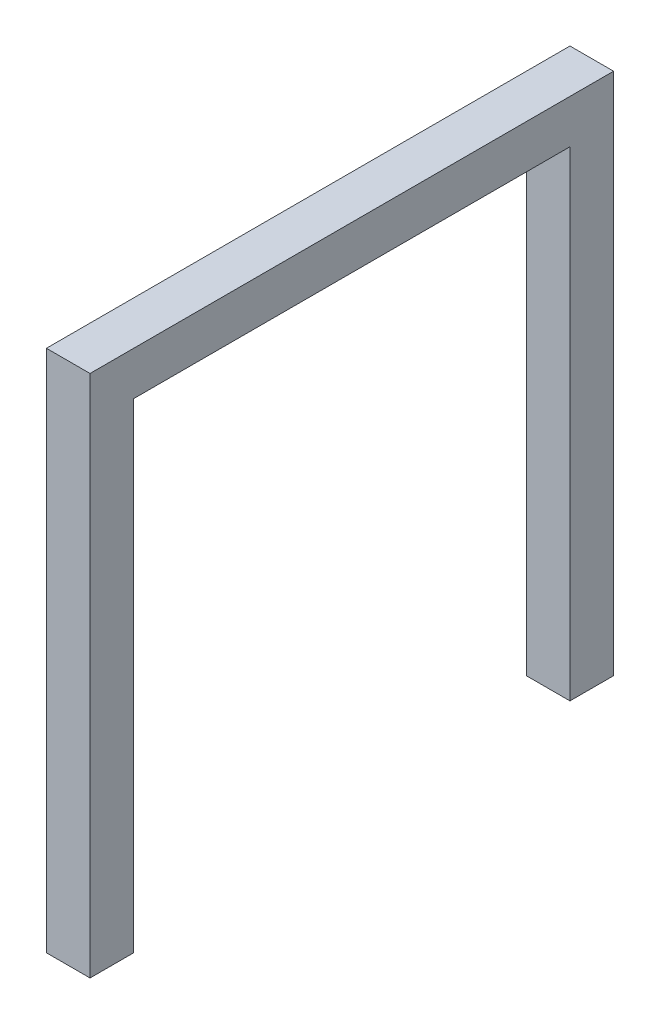
ISO-10303-21;
HEADER;
FILE_DESCRIPTION(('STEP AP214'),'2;1');
FILE_NAME('part.step','',(''),(''),'','','');
FILE_SCHEMA(('AUTOMOTIVE_DESIGN { 1 0 10303 214 1 1 1 1 }'));
ENDSEC;
DATA;
#1=APPLICATION_CONTEXT('core data for automotive mechanical design processes');
#2=APPLICATION_PROTOCOL_DEFINITION('international standard','automotive_design',2000,#1);
#3=PRODUCT_CONTEXT('',#1,'mechanical');
#4=PRODUCT('Part','Part','',(#3));
#5=PRODUCT_RELATED_PRODUCT_CATEGORY('part','',(#4));
#6=PRODUCT_DEFINITION_FORMATION('','',#4);
#7=PRODUCT_DEFINITION_CONTEXT('part definition',#1,'design');
#8=PRODUCT_DEFINITION('design','',#6,#7);
#9=PRODUCT_DEFINITION_SHAPE('','',#8);
#10=(LENGTH_UNIT() NAMED_UNIT(*) SI_UNIT(.MILLI.,.METRE.));
#11=(NAMED_UNIT(*) PLANE_ANGLE_UNIT() SI_UNIT($,.RADIAN.));
#12=(NAMED_UNIT(*) SI_UNIT($,.STERADIAN.) SOLID_ANGLE_UNIT());
#13=UNCERTAINTY_MEASURE_WITH_UNIT(LENGTH_MEASURE(1.E-05),#10,'distance_accuracy_value','');
#14=(GEOMETRIC_REPRESENTATION_CONTEXT(3) GLOBAL_UNCERTAINTY_ASSIGNED_CONTEXT((#13)) GLOBAL_UNIT_ASSIGNED_CONTEXT((#10,
#11,#12)) REPRESENTATION_CONTEXT('',''));
#15=CARTESIAN_POINT('',(0.,0.,0.));
#16=DIRECTION('',(0.,0.,1.));
#17=DIRECTION('',(1.,0.,0.));
#18=AXIS2_PLACEMENT_3D('',#15,#16,#17);
#19=CARTESIAN_POINT('',(-25.,-300.,300.));
#20=DIRECTION('',(0.,1.,0.));
#21=DIRECTION('',(0.,0.,1.));
#22=AXIS2_PLACEMENT_3D('',#19,#20,#21);
#23=PLANE('',#22);
#24=DIRECTION('',(0.,0.,-1.));
#25=VECTOR('',#24,1.);
#26=CARTESIAN_POINT('',(-25.,-300.,300.));
#27=LINE('',#26,#25);
#28=CARTESIAN_POINT('',(-25.,-300.,300.));
#29=VERTEX_POINT('',#28);
#30=CARTESIAN_POINT('',(-25.,-300.,250.));
#31=VERTEX_POINT('',#30);
#32=EDGE_CURVE('E126',#29,#31,#27,.T.);
#33=ORIENTED_EDGE('',*,*,#32,.T.);
#34=DIRECTION('',(1.,0.,0.));
#35=VECTOR('',#34,1.);
#36=CARTESIAN_POINT('',(-25.,-300.,250.));
#37=LINE('',#36,#35);
#38=CARTESIAN_POINT('',(25.,-300.,250.));
#39=VERTEX_POINT('',#38);
#40=EDGE_CURVE('E108',#31,#39,#37,.T.);
#41=ORIENTED_EDGE('',*,*,#40,.T.);
#42=DIRECTION('',(0.,0.,-1.));
#43=VECTOR('',#42,1.);
#44=CARTESIAN_POINT('',(25.,-300.,300.));
#45=LINE('',#44,#43);
#46=CARTESIAN_POINT('',(25.,-300.,300.));
#47=VERTEX_POINT('',#46);
#48=EDGE_CURVE('E132',#47,#39,#45,.T.);
#49=ORIENTED_EDGE('',*,*,#48,.F.);
#50=DIRECTION('',(1.,0.,0.));
#51=VECTOR('',#50,1.);
#52=CARTESIAN_POINT('',(-25.,-300.,300.));
#53=LINE('',#52,#51);
#54=EDGE_CURVE('E57',#29,#47,#53,.T.);
#55=ORIENTED_EDGE('',*,*,#54,.F.);
#56=EDGE_LOOP('',(#33,#41,#49,#55));
#57=FACE_BOUND('',#56,.T.);
#58=ADVANCED_FACE('F33',(#57),#23,.F.);
#59=CARTESIAN_POINT('',(25.,-300.,300.));
#60=DIRECTION('',(-1.,0.,0.));
#61=DIRECTION('',(0.,0.,1.));
#62=AXIS2_PLACEMENT_3D('',#59,#60,#61);
#63=PLANE('',#62);
#64=ORIENTED_EDGE('',*,*,#48,.T.);
#65=DIRECTION('',(0.,1.,0.));
#66=VECTOR('',#65,1.);
#67=CARTESIAN_POINT('',(25.,-300.,250.));
#68=LINE('',#67,#66);
#69=CARTESIAN_POINT('',(25.,250.,250.));
#70=VERTEX_POINT('',#69);
#71=EDGE_CURVE('E115',#39,#70,#68,.T.);
#72=ORIENTED_EDGE('',*,*,#71,.T.);
#73=DIRECTION('',(0.,0.,-1.));
#74=VECTOR('',#73,1.);
#75=CARTESIAN_POINT('',(25.,250.,300.));
#76=LINE('',#75,#74);
#77=CARTESIAN_POINT('',(25.,250.,-250.));
#78=VERTEX_POINT('',#77);
#79=EDGE_CURVE('E145',#70,#78,#76,.T.);
#80=ORIENTED_EDGE('',*,*,#79,.T.);
#81=DIRECTION('',(0.,-1.,0.));
#82=VECTOR('',#81,1.);
#83=CARTESIAN_POINT('',(25.,-300.,-250.));
#84=LINE('',#83,#82);
#85=CARTESIAN_POINT('',(25.,-300.,-250.));
#86=VERTEX_POINT('',#85);
#87=EDGE_CURVE('E154',#78,#86,#84,.T.);
#88=ORIENTED_EDGE('',*,*,#87,.T.);
#89=CARTESIAN_POINT('',(25.,-300.,-300.));
#90=VERTEX_POINT('',#89);
#91=EDGE_CURVE('E79',#86,#90,#45,.T.);
#92=ORIENTED_EDGE('',*,*,#91,.T.);
#93=DIRECTION('',(0.,1.,0.));
#94=VECTOR('',#93,1.);
#95=CARTESIAN_POINT('',(25.,-300.,-300.));
#96=LINE('',#95,#94);
#97=CARTESIAN_POINT('',(25.,300.,-300.));
#98=VERTEX_POINT('',#97);
#99=EDGE_CURVE('E143',#90,#98,#96,.T.);
#100=ORIENTED_EDGE('',*,*,#99,.T.);
#101=DIRECTION('',(0.,0.,-1.));
#102=VECTOR('',#101,1.);
#103=CARTESIAN_POINT('',(25.,300.,300.));
#104=LINE('',#103,#102);
#105=CARTESIAN_POINT('',(25.,300.,300.));
#106=VERTEX_POINT('',#105);
#107=EDGE_CURVE('E11',#106,#98,#104,.T.);
#108=ORIENTED_EDGE('',*,*,#107,.F.);
#109=DIRECTION('',(0.,1.,0.));
#110=VECTOR('',#109,1.);
#111=CARTESIAN_POINT('',(25.,-300.,300.));
#112=LINE('',#111,#110);
#113=EDGE_CURVE('E137',#47,#106,#112,.T.);
#114=ORIENTED_EDGE('',*,*,#113,.F.);
#115=EDGE_LOOP('',(#64,#72,#80,#88,#92,#100,#108,#114));
#116=FACE_BOUND('',#115,.T.);
#117=ADVANCED_FACE('F35',(#116),#63,.F.);
#118=CARTESIAN_POINT('',(-25.,300.,300.));
#119=DIRECTION('',(0.,-1.,0.));
#120=DIRECTION('',(0.,0.,-1.));
#121=AXIS2_PLACEMENT_3D('',#118,#119,#120);
#122=PLANE('',#121);
#123=DIRECTION('',(-1.,0.,0.));
#124=VECTOR('',#123,1.);
#125=CARTESIAN_POINT('',(-25.,300.,-300.));
#126=LINE('',#125,#124);
#127=CARTESIAN_POINT('',(-25.,300.,-300.));
#128=VERTEX_POINT('',#127);
#129=EDGE_CURVE('E141',#98,#128,#126,.T.);
#130=ORIENTED_EDGE('',*,*,#129,.T.);
#131=DIRECTION('',(0.,0.,-1.));
#132=VECTOR('',#131,1.);
#133=CARTESIAN_POINT('',(-25.,300.,300.));
#134=LINE('',#133,#132);
#135=CARTESIAN_POINT('',(-25.,300.,300.));
#136=VERTEX_POINT('',#135);
#137=EDGE_CURVE('E41',#136,#128,#134,.T.);
#138=ORIENTED_EDGE('',*,*,#137,.F.);
#139=DIRECTION('',(-1.,0.,0.));
#140=VECTOR('',#139,1.);
#141=CARTESIAN_POINT('',(-25.,300.,300.));
#142=LINE('',#141,#140);
#143=EDGE_CURVE('E86',#106,#136,#142,.T.);
#144=ORIENTED_EDGE('',*,*,#143,.F.);
#145=ORIENTED_EDGE('',*,*,#107,.T.);
#146=EDGE_LOOP('',(#130,#138,#144,#145));
#147=FACE_BOUND('',#146,.T.);
#148=ADVANCED_FACE('F189',(#147),#122,.F.);
#149=CARTESIAN_POINT('',(-25.,-300.,300.));
#150=DIRECTION('',(1.,0.,0.));
#151=DIRECTION('',(0.,0.,-1.));
#152=AXIS2_PLACEMENT_3D('',#149,#150,#151);
#153=PLANE('',#152);
#154=DIRECTION('',(0.,0.,1.));
#155=VECTOR('',#154,1.);
#156=CARTESIAN_POINT('',(-25.,250.,250.));
#157=LINE('',#156,#155);
#158=CARTESIAN_POINT('',(-25.,250.,-250.));
#159=VERTEX_POINT('',#158);
#160=CARTESIAN_POINT('',(-25.,250.,250.));
#161=VERTEX_POINT('',#160);
#162=EDGE_CURVE('E120',#159,#161,#157,.T.);
#163=ORIENTED_EDGE('',*,*,#162,.T.);
#164=DIRECTION('',(0.,-1.,0.));
#165=VECTOR('',#164,1.);
#166=CARTESIAN_POINT('',(-25.,-300.,250.));
#167=LINE('',#166,#165);
#168=EDGE_CURVE('E112',#161,#31,#167,.T.);
#169=ORIENTED_EDGE('',*,*,#168,.T.);
#170=ORIENTED_EDGE('',*,*,#32,.F.);
#171=DIRECTION('',(0.,-1.,0.));
#172=VECTOR('',#171,1.);
#173=CARTESIAN_POINT('',(-25.,-300.,300.));
#174=LINE('',#173,#172);
#175=EDGE_CURVE('E147',#136,#29,#174,.T.);
#176=ORIENTED_EDGE('',*,*,#175,.F.);
#177=ORIENTED_EDGE('',*,*,#137,.T.);
#178=DIRECTION('',(0.,-1.,0.));
#179=VECTOR('',#178,1.);
#180=CARTESIAN_POINT('',(-25.,-300.,-300.));
#181=LINE('',#180,#179);
#182=CARTESIAN_POINT('',(-25.,-300.,-300.));
#183=VERTEX_POINT('',#182);
#184=EDGE_CURVE('E138',#128,#183,#181,.T.);
#185=ORIENTED_EDGE('',*,*,#184,.T.);
#186=CARTESIAN_POINT('',(-25.,-300.,-250.));
#187=VERTEX_POINT('',#186);
#188=EDGE_CURVE('E129',#187,#183,#27,.T.);
#189=ORIENTED_EDGE('',*,*,#188,.F.);
#190=DIRECTION('',(0.,1.,0.));
#191=VECTOR('',#190,1.);
#192=CARTESIAN_POINT('',(-25.,-300.,-250.));
#193=LINE('',#192,#191);
#194=EDGE_CURVE('E48',#187,#159,#193,.T.);
#195=ORIENTED_EDGE('',*,*,#194,.T.);
#196=EDGE_LOOP('',(#163,#169,#170,#176,#177,#185,#189,#195));
#197=FACE_BOUND('',#196,.T.);
#198=ADVANCED_FACE('F124',(#197),#153,.F.);
#199=ORIENTED_EDGE('',*,*,#91,.F.);
#200=DIRECTION('',(1.,0.,0.));
#201=VECTOR('',#200,1.);
#202=CARTESIAN_POINT('',(-25.,-300.,-250.));
#203=LINE('',#202,#201);
#204=EDGE_CURVE('E119',#187,#86,#203,.T.);
#205=ORIENTED_EDGE('',*,*,#204,.F.);
#206=ORIENTED_EDGE('',*,*,#188,.T.);
#207=DIRECTION('',(1.,0.,0.));
#208=VECTOR('',#207,1.);
#209=CARTESIAN_POINT('',(-25.,-300.,-300.));
#210=LINE('',#209,#208);
#211=EDGE_CURVE('E135',#183,#90,#210,.T.);
#212=ORIENTED_EDGE('',*,*,#211,.T.);
#213=EDGE_LOOP('',(#199,#205,#206,#212));
#214=FACE_BOUND('',#213,.T.);
#215=ADVANCED_FACE('F167',(#214),#23,.F.);
#216=CARTESIAN_POINT('',(0.,0.,300.));
#217=DIRECTION('',(0.,0.,-1.));
#218=DIRECTION('',(-1.,0.,0.));
#219=AXIS2_PLACEMENT_3D('',#216,#217,#218);
#220=PLANE('',#219);
#221=ORIENTED_EDGE('',*,*,#113,.T.);
#222=ORIENTED_EDGE('',*,*,#143,.T.);
#223=ORIENTED_EDGE('',*,*,#175,.T.);
#224=ORIENTED_EDGE('',*,*,#54,.T.);
#225=EDGE_LOOP('',(#221,#222,#223,#224));
#226=FACE_BOUND('',#225,.T.);
#227=ADVANCED_FACE('F180',(#226),#220,.F.);
#228=CARTESIAN_POINT('',(0.,0.,-300.));
#229=DIRECTION('',(0.,0.,-1.));
#230=DIRECTION('',(-1.,0.,0.));
#231=AXIS2_PLACEMENT_3D('',#228,#229,#230);
#232=PLANE('',#231);
#233=ORIENTED_EDGE('',*,*,#99,.F.);
#234=ORIENTED_EDGE('',*,*,#211,.F.);
#235=ORIENTED_EDGE('',*,*,#184,.F.);
#236=ORIENTED_EDGE('',*,*,#129,.F.);
#237=EDGE_LOOP('',(#233,#234,#235,#236));
#238=FACE_BOUND('',#237,.T.);
#239=ADVANCED_FACE('F173',(#238),#232,.T.);
#240=CARTESIAN_POINT('',(-25.,250.,250.));
#241=DIRECTION('',(0.,1.,0.));
#242=DIRECTION('',(0.,0.,1.));
#243=AXIS2_PLACEMENT_3D('',#240,#241,#242);
#244=PLANE('',#243);
#245=DIRECTION('',(1.,0.,0.));
#246=VECTOR('',#245,1.);
#247=CARTESIAN_POINT('',(-25.,250.,250.));
#248=LINE('',#247,#246);
#249=EDGE_CURVE('E155',#161,#70,#248,.T.);
#250=ORIENTED_EDGE('',*,*,#249,.F.);
#251=ORIENTED_EDGE('',*,*,#162,.F.);
#252=DIRECTION('',(1.,0.,0.));
#253=VECTOR('',#252,1.);
#254=CARTESIAN_POINT('',(-25.,250.,-250.));
#255=LINE('',#254,#253);
#256=EDGE_CURVE('E158',#159,#78,#255,.T.);
#257=ORIENTED_EDGE('',*,*,#256,.T.);
#258=ORIENTED_EDGE('',*,*,#79,.F.);
#259=EDGE_LOOP('',(#250,#251,#257,#258));
#260=FACE_BOUND('',#259,.T.);
#261=ADVANCED_FACE('F171',(#260),#244,.F.);
#262=CARTESIAN_POINT('',(-25.,-300.,250.));
#263=DIRECTION('',(0.,0.,1.));
#264=DIRECTION('',(1.,0.,0.));
#265=AXIS2_PLACEMENT_3D('',#262,#263,#264);
#266=PLANE('',#265);
#267=ORIENTED_EDGE('',*,*,#40,.F.);
#268=ORIENTED_EDGE('',*,*,#168,.F.);
#269=ORIENTED_EDGE('',*,*,#249,.T.);
#270=ORIENTED_EDGE('',*,*,#71,.F.);
#271=EDGE_LOOP('',(#267,#268,#269,#270));
#272=FACE_BOUND('',#271,.T.);
#273=ADVANCED_FACE('F110',(#272),#266,.F.);
#274=CARTESIAN_POINT('',(-25.,-300.,-250.));
#275=DIRECTION('',(0.,0.,-1.));
#276=DIRECTION('',(-1.,0.,0.));
#277=AXIS2_PLACEMENT_3D('',#274,#275,#276);
#278=PLANE('',#277);
#279=ORIENTED_EDGE('',*,*,#256,.F.);
#280=ORIENTED_EDGE('',*,*,#194,.F.);
#281=ORIENTED_EDGE('',*,*,#204,.T.);
#282=ORIENTED_EDGE('',*,*,#87,.F.);
#283=EDGE_LOOP('',(#279,#280,#281,#282));
#284=FACE_BOUND('',#283,.T.);
#285=ADVANCED_FACE('F169',(#284),#278,.F.);
#286=CLOSED_SHELL('',(#58,#117,#148,#198,#215,#227,#239,#261,#273,#285));
#287=MANIFOLD_SOLID_BREP('B2',#286);
#288=ADVANCED_BREP_SHAPE_REPRESENTATION('',(#18,#287),#14);
#289=SHAPE_DEFINITION_REPRESENTATION(#9,#288);
ENDSEC;
END-ISO-10303-21;
